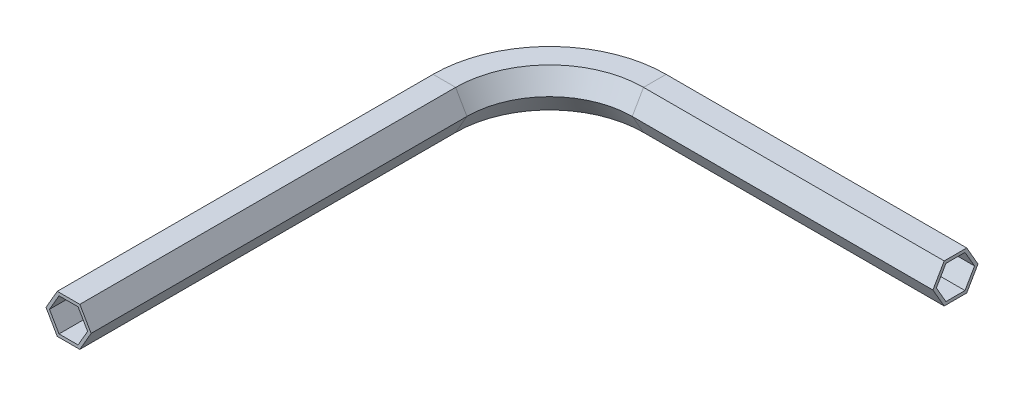
ISO-10303-21;
HEADER;
FILE_DESCRIPTION(('STEP AP214'),'2;1');
FILE_NAME('part.step','',(''),(''),'','','');
FILE_SCHEMA(('AUTOMOTIVE_DESIGN { 1 0 10303 214 1 1 1 1 }'));
ENDSEC;
DATA;
#1=APPLICATION_CONTEXT('core data for automotive mechanical design processes');
#2=APPLICATION_PROTOCOL_DEFINITION('international standard','automotive_design',2000,#1);
#3=PRODUCT_CONTEXT('',#1,'mechanical');
#4=PRODUCT('Part','Part','',(#3));
#5=PRODUCT_RELATED_PRODUCT_CATEGORY('part','',(#4));
#6=PRODUCT_DEFINITION_FORMATION('','',#4);
#7=PRODUCT_DEFINITION_CONTEXT('part definition',#1,'design');
#8=PRODUCT_DEFINITION('design','',#6,#7);
#9=PRODUCT_DEFINITION_SHAPE('','',#8);
#10=(LENGTH_UNIT() NAMED_UNIT(*) SI_UNIT(.MILLI.,.METRE.));
#11=(NAMED_UNIT(*) PLANE_ANGLE_UNIT() SI_UNIT($,.RADIAN.));
#12=(NAMED_UNIT(*) SI_UNIT($,.STERADIAN.) SOLID_ANGLE_UNIT());
#13=UNCERTAINTY_MEASURE_WITH_UNIT(LENGTH_MEASURE(1.E-05),#10,'distance_accuracy_value','');
#14=(GEOMETRIC_REPRESENTATION_CONTEXT(3) GLOBAL_UNCERTAINTY_ASSIGNED_CONTEXT((#13)) GLOBAL_UNIT_ASSIGNED_CONTEXT((#10,
#11,#12)) REPRESENTATION_CONTEXT('',''));
#15=CARTESIAN_POINT('',(0.,0.,0.));
#16=DIRECTION('',(0.,0.,1.));
#17=DIRECTION('',(1.,0.,0.));
#18=AXIS2_PLACEMENT_3D('',#15,#16,#17);
#19=CARTESIAN_POINT('',(0.,0.,0.));
#20=DIRECTION('',(0.,0.,1.));
#21=DIRECTION('',(1.,0.,0.));
#22=AXIS2_PLACEMENT_3D('',#19,#20,#21);
#23=PLANE('',#22);
#24=DIRECTION('',(-0.5,0.866025403784439,0.));
#25=VECTOR('',#24,1.);
#26=CARTESIAN_POINT('',(150.,0.,0.));
#27=LINE('',#26,#25);
#28=CARTESIAN_POINT('',(150.,0.,0.));
#29=VERTEX_POINT('',#28);
#30=CARTESIAN_POINT('',(75.,129.903810567666,0.));
#31=VERTEX_POINT('',#30);
#32=EDGE_CURVE('E367',#29,#31,#27,.T.);
#33=ORIENTED_EDGE('',*,*,#32,.T.);
#34=DIRECTION('',(-1.,0.,0.));
#35=VECTOR('',#34,1.);
#36=CARTESIAN_POINT('',(75.,129.903810567666,0.));
#37=LINE('',#36,#35);
#38=CARTESIAN_POINT('',(-75.,129.903810567666,0.));
#39=VERTEX_POINT('',#38);
#40=EDGE_CURVE('E371',#31,#39,#37,.T.);
#41=ORIENTED_EDGE('',*,*,#40,.T.);
#42=DIRECTION('',(-0.5,-0.866025403784439,0.));
#43=VECTOR('',#42,1.);
#44=CARTESIAN_POINT('',(-75.,129.903810567666,0.));
#45=LINE('',#44,#43);
#46=CARTESIAN_POINT('',(-150.,0.,0.));
#47=VERTEX_POINT('',#46);
#48=EDGE_CURVE('E416',#39,#47,#45,.T.);
#49=ORIENTED_EDGE('',*,*,#48,.T.);
#50=DIRECTION('',(0.5,-0.866025403784438,0.));
#51=VECTOR('',#50,1.);
#52=CARTESIAN_POINT('',(-150.,0.,0.));
#53=LINE('',#52,#51);
#54=CARTESIAN_POINT('',(-75.,-129.903810567666,0.));
#55=VERTEX_POINT('',#54);
#56=EDGE_CURVE('E443',#47,#55,#53,.T.);
#57=ORIENTED_EDGE('',*,*,#56,.T.);
#58=DIRECTION('',(1.,0.,0.));
#59=VECTOR('',#58,1.);
#60=CARTESIAN_POINT('',(-75.,-129.903810567666,0.));
#61=LINE('',#60,#59);
#62=CARTESIAN_POINT('',(75.,-129.903810567666,0.));
#63=VERTEX_POINT('',#62);
#64=EDGE_CURVE('E470',#55,#63,#61,.T.);
#65=ORIENTED_EDGE('',*,*,#64,.T.);
#66=DIRECTION('',(0.5,0.866025403784439,0.));
#67=VECTOR('',#66,1.);
#68=CARTESIAN_POINT('',(75.,-129.903810567666,0.));
#69=LINE('',#68,#67);
#70=EDGE_CURVE('E385',#63,#29,#69,.T.);
#71=ORIENTED_EDGE('',*,*,#70,.T.);
#72=EDGE_LOOP('',(#33,#41,#49,#57,#65,#71));
#73=FACE_BOUND('',#72,.T.);
#74=DIRECTION('',(-0.5,0.866025403784439,0.));
#75=VECTOR('',#74,1.);
#76=CARTESIAN_POINT('',(126.905989232415,0.,0.));
#77=LINE('',#76,#75);
#78=CARTESIAN_POINT('',(126.905989232415,0.,0.));
#79=VERTEX_POINT('',#78);
#80=CARTESIAN_POINT('',(63.4529946162075,109.903810567666,0.));
#81=VERTEX_POINT('',#80);
#82=EDGE_CURVE('E221',#79,#81,#77,.T.);
#83=ORIENTED_EDGE('',*,*,#82,.F.);
#84=DIRECTION('',(0.5,0.866025403784439,0.));
#85=VECTOR('',#84,1.);
#86=CARTESIAN_POINT('',(63.4529946162075,-109.903810567666,0.));
#87=LINE('',#86,#85);
#88=CARTESIAN_POINT('',(63.4529946162075,-109.903810567666,0.));
#89=VERTEX_POINT('',#88);
#90=EDGE_CURVE('E213',#89,#79,#87,.T.);
#91=ORIENTED_EDGE('',*,*,#90,.F.);
#92=DIRECTION('',(1.,0.,0.));
#93=VECTOR('',#92,1.);
#94=CARTESIAN_POINT('',(-63.4529946162074,-109.903810567666,0.));
#95=LINE('',#94,#93);
#96=CARTESIAN_POINT('',(-63.4529946162074,-109.903810567666,0.));
#97=VERTEX_POINT('',#96);
#98=EDGE_CURVE('E199',#97,#89,#95,.T.);
#99=ORIENTED_EDGE('',*,*,#98,.F.);
#100=DIRECTION('',(0.5,-0.866025403784438,0.));
#101=VECTOR('',#100,1.);
#102=CARTESIAN_POINT('',(-126.905989232415,0.,0.));
#103=LINE('',#102,#101);
#104=CARTESIAN_POINT('',(-126.905989232415,0.,0.));
#105=VERTEX_POINT('',#104);
#106=EDGE_CURVE('E207',#105,#97,#103,.T.);
#107=ORIENTED_EDGE('',*,*,#106,.F.);
#108=DIRECTION('',(-0.5,-0.866025403784439,0.));
#109=VECTOR('',#108,1.);
#110=CARTESIAN_POINT('',(-63.4529946162075,109.903810567666,0.));
#111=LINE('',#110,#109);
#112=CARTESIAN_POINT('',(-63.4529946162075,109.903810567666,0.));
#113=VERTEX_POINT('',#112);
#114=EDGE_CURVE('E286',#113,#105,#111,.T.);
#115=ORIENTED_EDGE('',*,*,#114,.F.);
#116=DIRECTION('',(-1.,0.,0.));
#117=VECTOR('',#116,1.);
#118=CARTESIAN_POINT('',(63.4529946162075,109.903810567666,0.));
#119=LINE('',#118,#117);
#120=EDGE_CURVE('E225',#81,#113,#119,.T.);
#121=ORIENTED_EDGE('',*,*,#120,.F.);
#122=EDGE_LOOP('',(#83,#91,#99,#107,#115,#121));
#123=FACE_BOUND('',#122,.T.);
#124=ADVANCED_FACE('F39',(#73,#123),#23,.T.);
#125=CARTESIAN_POINT('',(2700.,0.,-3200.));
#126=DIRECTION('',(-1.,0.,0.));
#127=DIRECTION('',(0.,0.,1.));
#128=AXIS2_PLACEMENT_3D('',#125,#126,#127);
#129=PLANE('',#128);
#130=DIRECTION('',(0.,0.866025403784439,-0.5));
#131=VECTOR('',#130,1.);
#132=CARTESIAN_POINT('',(2700.,0.,-3050.));
#133=LINE('',#132,#131);
#134=CARTESIAN_POINT('',(2700.,0.,-3050.));
#135=VERTEX_POINT('',#134);
#136=CARTESIAN_POINT('',(2700.,129.903810567666,-3125.));
#137=VERTEX_POINT('',#136);
#138=EDGE_CURVE('E400',#135,#137,#133,.T.);
#139=ORIENTED_EDGE('',*,*,#138,.F.);
#140=DIRECTION('',(0.,0.866025403784439,0.5));
#141=VECTOR('',#140,1.);
#142=CARTESIAN_POINT('',(2700.,-129.903810567666,-3125.));
#143=LINE('',#142,#141);
#144=CARTESIAN_POINT('',(2700.,-129.903810567666,-3125.));
#145=VERTEX_POINT('',#144);
#146=EDGE_CURVE('E11',#145,#135,#143,.T.);
#147=ORIENTED_EDGE('',*,*,#146,.F.);
#148=DIRECTION('',(0.,0.,1.));
#149=VECTOR('',#148,1.);
#150=CARTESIAN_POINT('',(2700.,-129.903810567666,-3275.));
#151=LINE('',#150,#149);
#152=CARTESIAN_POINT('',(2700.,-129.903810567666,-3275.));
#153=VERTEX_POINT('',#152);
#154=EDGE_CURVE('E493',#153,#145,#151,.T.);
#155=ORIENTED_EDGE('',*,*,#154,.F.);
#156=DIRECTION('',(0.,-0.866025403784438,0.5));
#157=VECTOR('',#156,1.);
#158=CARTESIAN_POINT('',(2700.,0.,-3350.));
#159=LINE('',#158,#157);
#160=CARTESIAN_POINT('',(2700.,0.,-3350.));
#161=VERTEX_POINT('',#160);
#162=EDGE_CURVE('E466',#161,#153,#159,.T.);
#163=ORIENTED_EDGE('',*,*,#162,.F.);
#164=DIRECTION('',(0.,-0.866025403784439,-0.5));
#165=VECTOR('',#164,1.);
#166=CARTESIAN_POINT('',(2700.,129.903810567666,-3275.));
#167=LINE('',#166,#165);
#168=CARTESIAN_POINT('',(2700.,129.903810567666,-3275.));
#169=VERTEX_POINT('',#168);
#170=EDGE_CURVE('E439',#169,#161,#167,.T.);
#171=ORIENTED_EDGE('',*,*,#170,.F.);
#172=DIRECTION('',(0.,0.,-1.));
#173=VECTOR('',#172,1.);
#174=CARTESIAN_POINT('',(2700.,129.903810567666,-3125.));
#175=LINE('',#174,#173);
#176=EDGE_CURVE('E408',#137,#169,#175,.T.);
#177=ORIENTED_EDGE('',*,*,#176,.F.);
#178=EDGE_LOOP('',(#139,#147,#155,#163,#171,#177));
#179=FACE_BOUND('',#178,.T.);
#180=DIRECTION('',(0.,0.866025403784438,0.5));
#181=VECTOR('',#180,1.);
#182=CARTESIAN_POINT('',(2700.,-109.903810567665,-3136.54700538379));
#183=LINE('',#182,#181);
#184=CARTESIAN_POINT('',(2700.,-109.903810567665,-3136.54700538379));
#185=VERTEX_POINT('',#184);
#186=CARTESIAN_POINT('',(2700.,4.76135235692095E-13,-3073.09401076759));
#187=VERTEX_POINT('',#186);
#188=EDGE_CURVE('E248',#185,#187,#183,.T.);
#189=ORIENTED_EDGE('',*,*,#188,.T.);
#190=DIRECTION('',(0.,0.866025403784439,-0.5));
#191=VECTOR('',#190,1.);
#192=CARTESIAN_POINT('',(2700.,4.76135235692095E-13,-3073.09401076759));
#193=LINE('',#192,#191);
#194=CARTESIAN_POINT('',(2700.,109.903810567666,-3136.54700538379));
#195=VERTEX_POINT('',#194);
#196=EDGE_CURVE('E256',#187,#195,#193,.T.);
#197=ORIENTED_EDGE('',*,*,#196,.T.);
#198=DIRECTION('',(0.,0.,-1.));
#199=VECTOR('',#198,1.);
#200=CARTESIAN_POINT('',(2700.,109.903810567666,-3136.54700538379));
#201=LINE('',#200,#199);
#202=CARTESIAN_POINT('',(2700.,109.903810567666,-3263.45299461621));
#203=VERTEX_POINT('',#202);
#204=EDGE_CURVE('E283',#195,#203,#201,.T.);
#205=ORIENTED_EDGE('',*,*,#204,.T.);
#206=DIRECTION('',(0.,-0.866025403784438,-0.5));
#207=VECTOR('',#206,1.);
#208=CARTESIAN_POINT('',(2700.,109.903810567666,-3263.45299461621));
#209=LINE('',#208,#207);
#210=CARTESIAN_POINT('',(2700.,5.15428102636023E-13,-3326.90598923241));
#211=VERTEX_POINT('',#210);
#212=EDGE_CURVE('E310',#203,#211,#209,.T.);
#213=ORIENTED_EDGE('',*,*,#212,.T.);
#214=DIRECTION('',(0.,-0.866025403784439,0.5));
#215=VECTOR('',#214,1.);
#216=CARTESIAN_POINT('',(2700.,5.15428102636023E-13,-3326.90598923241));
#217=LINE('',#216,#215);
#218=CARTESIAN_POINT('',(2700.,-109.903810567665,-3263.45299461621));
#219=VERTEX_POINT('',#218);
#220=EDGE_CURVE('E336',#211,#219,#217,.T.);
#221=ORIENTED_EDGE('',*,*,#220,.T.);
#222=DIRECTION('',(0.,0.,1.));
#223=VECTOR('',#222,1.);
#224=CARTESIAN_POINT('',(2700.,-109.903810567665,-3263.45299461621));
#225=LINE('',#224,#223);
#226=EDGE_CURVE('E357',#219,#185,#225,.T.);
#227=ORIENTED_EDGE('',*,*,#226,.T.);
#228=EDGE_LOOP('',(#189,#197,#205,#213,#221,#227));
#229=FACE_BOUND('',#228,.T.);
#230=ADVANCED_FACE('F558',(#179,#229),#129,.F.);
#231=CARTESIAN_POINT('',(150.,0.,0.));
#232=DIRECTION('',(-0.866025403784438,-0.5,0.));
#233=DIRECTION('',(0.5,-0.866025403784439,0.));
#234=AXIS2_PLACEMENT_3D('',#231,#232,#233);
#235=PLANE('',#234);
#236=DIRECTION('',(0.,0.,-1.));
#237=VECTOR('',#236,1.);
#238=CARTESIAN_POINT('',(75.,129.903810567666,0.));
#239=LINE('',#238,#237);
#240=CARTESIAN_POINT('',(75.,129.903810567666,-2500.));
#241=VERTEX_POINT('',#240);
#242=EDGE_CURVE('E376',#31,#241,#239,.T.);
#243=ORIENTED_EDGE('',*,*,#242,.F.);
#244=ORIENTED_EDGE('',*,*,#32,.F.);
#245=DIRECTION('',(0.,0.,-1.));
#246=VECTOR('',#245,1.);
#247=CARTESIAN_POINT('',(150.,0.,0.));
#248=LINE('',#247,#246);
#249=CARTESIAN_POINT('',(150.,0.,-2500.));
#250=VERTEX_POINT('',#249);
#251=EDGE_CURVE('E377',#29,#250,#248,.T.);
#252=ORIENTED_EDGE('',*,*,#251,.T.);
#253=DIRECTION('',(-0.5,0.866025403784439,0.));
#254=VECTOR('',#253,1.);
#255=CARTESIAN_POINT('',(150.,0.,-2500.));
#256=LINE('',#255,#254);
#257=EDGE_CURVE('E372',#250,#241,#256,.T.);
#258=ORIENTED_EDGE('',*,*,#257,.T.);
#259=EDGE_LOOP('',(#243,#244,#252,#258));
#260=FACE_BOUND('',#259,.T.);
#261=ADVANCED_FACE('F539',(#260),#235,.F.);
#262=CARTESIAN_POINT('',(75.,129.903810567666,0.));
#263=DIRECTION('',(0.,-1.,0.));
#264=DIRECTION('',(1.,0.,0.));
#265=AXIS2_PLACEMENT_3D('',#262,#263,#264);
#266=PLANE('',#265);
#267=DIRECTION('',(0.,0.,-1.));
#268=VECTOR('',#267,1.);
#269=CARTESIAN_POINT('',(-75.,129.903810567666,0.));
#270=LINE('',#269,#268);
#271=CARTESIAN_POINT('',(-75.,129.903810567666,-2500.));
#272=VERTEX_POINT('',#271);
#273=EDGE_CURVE('E420',#39,#272,#270,.T.);
#274=ORIENTED_EDGE('',*,*,#273,.F.);
#275=ORIENTED_EDGE('',*,*,#40,.F.);
#276=ORIENTED_EDGE('',*,*,#242,.T.);
#277=DIRECTION('',(-1.,0.,0.));
#278=VECTOR('',#277,1.);
#279=CARTESIAN_POINT('',(75.,129.903810567666,-2500.));
#280=LINE('',#279,#278);
#281=EDGE_CURVE('E381',#241,#272,#280,.T.);
#282=ORIENTED_EDGE('',*,*,#281,.T.);
#283=EDGE_LOOP('',(#274,#275,#276,#282));
#284=FACE_BOUND('',#283,.T.);
#285=ADVANCED_FACE('F570',(#284),#266,.F.);
#286=CARTESIAN_POINT('',(-75.,129.903810567666,0.));
#287=DIRECTION('',(0.866025403784438,-0.5,0.));
#288=DIRECTION('',(0.5,0.866025403784439,0.));
#289=AXIS2_PLACEMENT_3D('',#286,#287,#288);
#290=PLANE('',#289);
#291=DIRECTION('',(0.,0.,-1.));
#292=VECTOR('',#291,1.);
#293=CARTESIAN_POINT('',(-150.,0.,0.));
#294=LINE('',#293,#292);
#295=CARTESIAN_POINT('',(-150.,0.,-2500.));
#296=VERTEX_POINT('',#295);
#297=EDGE_CURVE('E447',#47,#296,#294,.T.);
#298=ORIENTED_EDGE('',*,*,#297,.F.);
#299=ORIENTED_EDGE('',*,*,#48,.F.);
#300=ORIENTED_EDGE('',*,*,#273,.T.);
#301=DIRECTION('',(-0.5,-0.866025403784439,0.));
#302=VECTOR('',#301,1.);
#303=CARTESIAN_POINT('',(-75.,129.903810567666,-2500.));
#304=LINE('',#303,#302);
#305=EDGE_CURVE('E424',#272,#296,#304,.T.);
#306=ORIENTED_EDGE('',*,*,#305,.T.);
#307=EDGE_LOOP('',(#298,#299,#300,#306));
#308=FACE_BOUND('',#307,.T.);
#309=ADVANCED_FACE('F586',(#308),#290,.F.);
#310=CARTESIAN_POINT('',(-150.,0.,0.));
#311=DIRECTION('',(0.866025403784439,0.5,0.));
#312=DIRECTION('',(-0.5,0.866025403784439,0.));
#313=AXIS2_PLACEMENT_3D('',#310,#311,#312);
#314=PLANE('',#313);
#315=DIRECTION('',(0.,0.,-1.));
#316=VECTOR('',#315,1.);
#317=CARTESIAN_POINT('',(-75.,-129.903810567666,0.));
#318=LINE('',#317,#316);
#319=CARTESIAN_POINT('',(-75.,-129.903810567666,-2500.));
#320=VERTEX_POINT('',#319);
#321=EDGE_CURVE('E474',#55,#320,#318,.T.);
#322=ORIENTED_EDGE('',*,*,#321,.F.);
#323=ORIENTED_EDGE('',*,*,#56,.F.);
#324=ORIENTED_EDGE('',*,*,#297,.T.);
#325=DIRECTION('',(0.5,-0.866025403784438,0.));
#326=VECTOR('',#325,1.);
#327=CARTESIAN_POINT('',(-150.,0.,-2500.));
#328=LINE('',#327,#326);
#329=EDGE_CURVE('E451',#296,#320,#328,.T.);
#330=ORIENTED_EDGE('',*,*,#329,.T.);
#331=EDGE_LOOP('',(#322,#323,#324,#330));
#332=FACE_BOUND('',#331,.T.);
#333=ADVANCED_FACE('F574',(#332),#314,.F.);
#334=CARTESIAN_POINT('',(-75.,-129.903810567666,0.));
#335=DIRECTION('',(0.,1.,0.));
#336=DIRECTION('',(-1.,0.,0.));
#337=AXIS2_PLACEMENT_3D('',#334,#335,#336);
#338=PLANE('',#337);
#339=DIRECTION('',(0.,0.,-1.));
#340=VECTOR('',#339,1.);
#341=CARTESIAN_POINT('',(75.,-129.903810567666,0.));
#342=LINE('',#341,#340);
#343=CARTESIAN_POINT('',(75.,-129.903810567666,-2500.));
#344=VERTEX_POINT('',#343);
#345=EDGE_CURVE('E500',#63,#344,#342,.T.);
#346=ORIENTED_EDGE('',*,*,#345,.F.);
#347=ORIENTED_EDGE('',*,*,#64,.F.);
#348=ORIENTED_EDGE('',*,*,#321,.T.);
#349=DIRECTION('',(1.,0.,0.));
#350=VECTOR('',#349,1.);
#351=CARTESIAN_POINT('',(-75.,-129.903810567666,-2500.));
#352=LINE('',#351,#350);
#353=EDGE_CURVE('E478',#320,#344,#352,.T.);
#354=ORIENTED_EDGE('',*,*,#353,.T.);
#355=EDGE_LOOP('',(#346,#347,#348,#354));
#356=FACE_BOUND('',#355,.T.);
#357=ADVANCED_FACE('F545',(#356),#338,.F.);
#358=CARTESIAN_POINT('',(75.,-129.903810567666,0.));
#359=DIRECTION('',(-0.866025403784438,0.5,0.));
#360=DIRECTION('',(-0.5,-0.866025403784439,0.));
#361=AXIS2_PLACEMENT_3D('',#358,#359,#360);
#362=PLANE('',#361);
#363=DIRECTION('',(0.5,0.866025403784439,0.));
#364=VECTOR('',#363,1.);
#365=CARTESIAN_POINT('',(75.,-129.903810567666,-2500.));
#366=LINE('',#365,#364);
#367=EDGE_CURVE('E399',#344,#250,#366,.T.);
#368=ORIENTED_EDGE('',*,*,#367,.T.);
#369=ORIENTED_EDGE('',*,*,#251,.F.);
#370=ORIENTED_EDGE('',*,*,#70,.F.);
#371=ORIENTED_EDGE('',*,*,#345,.T.);
#372=EDGE_LOOP('',(#368,#369,#370,#371));
#373=FACE_BOUND('',#372,.T.);
#374=ADVANCED_FACE('F541',(#373),#362,.F.);
#375=CARTESIAN_POINT('',(700.,0.,-2500.));
#376=DIRECTION('',(0.,1.,0.));
#377=DIRECTION('',(0.,0.,1.));
#378=AXIS2_PLACEMENT_3D('',#375,#376,#377);
#379=CONICAL_SURFACE('',#378,550.,0.523598775598299);
#380=CARTESIAN_POINT('',(700.,129.903810567666,-2500.));
#381=DIRECTION('',(0.,-1.,0.));
#382=DIRECTION('',(-1.,0.,0.));
#383=AXIS2_PLACEMENT_3D('',#380,#381,#382);
#384=CIRCLE('',#383,625.);
#385=CARTESIAN_POINT('',(700.,129.903810567666,-3125.));
#386=VERTEX_POINT('',#385);
#387=EDGE_CURVE('E390',#241,#386,#384,.T.);
#388=ORIENTED_EDGE('',*,*,#387,.F.);
#389=ORIENTED_EDGE('',*,*,#257,.F.);
#390=CARTESIAN_POINT('',(700.,0.,-2500.));
#391=DIRECTION('',(0.,-1.,0.));
#392=DIRECTION('',(-1.,0.,0.));
#393=AXIS2_PLACEMENT_3D('',#390,#391,#392);
#394=CIRCLE('',#393,550.);
#395=CARTESIAN_POINT('',(700.,0.,-3050.));
#396=VERTEX_POINT('',#395);
#397=EDGE_CURVE('E391',#250,#396,#394,.T.);
#398=ORIENTED_EDGE('',*,*,#397,.T.);
#399=DIRECTION('',(0.,0.866025403784439,-0.5));
#400=VECTOR('',#399,1.);
#401=CARTESIAN_POINT('',(700.,0.,-3050.));
#402=LINE('',#401,#400);
#403=EDGE_CURVE('E386',#396,#386,#402,.T.);
#404=ORIENTED_EDGE('',*,*,#403,.T.);
#405=EDGE_LOOP('',(#388,#389,#398,#404));
#406=FACE_BOUND('',#405,.T.);
#407=ADVANCED_FACE('F534',(#406),#379,.F.);
#408=CARTESIAN_POINT('',(74.9999999999999,129.903810567666,-2500.));
#409=DIRECTION('',(0.,-1.,0.));
#410=DIRECTION('',(0.,0.,-1.));
#411=AXIS2_PLACEMENT_3D('',#408,#409,#410);
#412=PLANE('',#411);
#413=CARTESIAN_POINT('',(700.,129.903810567666,-2500.));
#414=DIRECTION('',(0.,-1.,0.));
#415=DIRECTION('',(-1.,0.,0.));
#416=AXIS2_PLACEMENT_3D('',#413,#414,#415);
#417=CIRCLE('',#416,775.);
#418=CARTESIAN_POINT('',(700.,129.903810567666,-3275.));
#419=VERTEX_POINT('',#418);
#420=EDGE_CURVE('E428',#272,#419,#417,.T.);
#421=ORIENTED_EDGE('',*,*,#420,.F.);
#422=ORIENTED_EDGE('',*,*,#281,.F.);
#423=ORIENTED_EDGE('',*,*,#387,.T.);
#424=DIRECTION('',(0.,0.,-1.));
#425=VECTOR('',#424,1.);
#426=CARTESIAN_POINT('',(700.,129.903810567666,-3125.));
#427=LINE('',#426,#425);
#428=EDGE_CURVE('E395',#386,#419,#427,.T.);
#429=ORIENTED_EDGE('',*,*,#428,.T.);
#430=EDGE_LOOP('',(#421,#422,#423,#429));
#431=FACE_BOUND('',#430,.T.);
#432=ADVANCED_FACE('F566',(#431),#412,.F.);
#433=CARTESIAN_POINT('',(700.,129.903810567666,-2500.));
#434=DIRECTION('',(0.,-1.,0.));
#435=DIRECTION('',(0.,0.,-1.));
#436=AXIS2_PLACEMENT_3D('',#433,#434,#435);
#437=CONICAL_SURFACE('',#436,775.,0.523598775598299);
#438=CARTESIAN_POINT('',(700.,0.,-2500.));
#439=DIRECTION('',(0.,-1.,0.));
#440=DIRECTION('',(-1.,0.,0.));
#441=AXIS2_PLACEMENT_3D('',#438,#439,#440);
#442=CIRCLE('',#441,850.);
#443=CARTESIAN_POINT('',(700.,0.,-3350.));
#444=VERTEX_POINT('',#443);
#445=EDGE_CURVE('E455',#296,#444,#442,.T.);
#446=ORIENTED_EDGE('',*,*,#445,.F.);
#447=ORIENTED_EDGE('',*,*,#305,.F.);
#448=ORIENTED_EDGE('',*,*,#420,.T.);
#449=DIRECTION('',(0.,-0.866025403784439,-0.5));
#450=VECTOR('',#449,1.);
#451=CARTESIAN_POINT('',(700.,129.903810567666,-3275.));
#452=LINE('',#451,#450);
#453=EDGE_CURVE('E432',#419,#444,#452,.T.);
#454=ORIENTED_EDGE('',*,*,#453,.T.);
#455=EDGE_LOOP('',(#446,#447,#448,#454));
#456=FACE_BOUND('',#455,.T.);
#457=ADVANCED_FACE('F584',(#456),#437,.T.);
#458=CARTESIAN_POINT('',(700.,0.,-2500.));
#459=DIRECTION('',(0.,1.,0.));
#460=DIRECTION('',(0.,0.,1.));
#461=AXIS2_PLACEMENT_3D('',#458,#459,#460);
#462=CONICAL_SURFACE('',#461,850.,0.523598775598299);
#463=CARTESIAN_POINT('',(700.,-129.903810567666,-2500.));
#464=DIRECTION('',(0.,-1.,0.));
#465=DIRECTION('',(-1.,0.,0.));
#466=AXIS2_PLACEMENT_3D('',#463,#464,#465);
#467=CIRCLE('',#466,775.);
#468=CARTESIAN_POINT('',(700.,-129.903810567666,-3275.));
#469=VERTEX_POINT('',#468);
#470=EDGE_CURVE('E482',#320,#469,#467,.T.);
#471=ORIENTED_EDGE('',*,*,#470,.F.);
#472=ORIENTED_EDGE('',*,*,#329,.F.);
#473=ORIENTED_EDGE('',*,*,#445,.T.);
#474=DIRECTION('',(0.,-0.866025403784438,0.5));
#475=VECTOR('',#474,1.);
#476=CARTESIAN_POINT('',(700.,0.,-3350.));
#477=LINE('',#476,#475);
#478=EDGE_CURVE('E459',#444,#469,#477,.T.);
#479=ORIENTED_EDGE('',*,*,#478,.T.);
#480=EDGE_LOOP('',(#471,#472,#473,#479));
#481=FACE_BOUND('',#480,.T.);
#482=ADVANCED_FACE('F577',(#481),#462,.T.);
#483=CARTESIAN_POINT('',(-75.0000000000001,-129.903810567666,-2500.));
#484=DIRECTION('',(0.,1.,0.));
#485=DIRECTION('',(0.,0.,1.));
#486=AXIS2_PLACEMENT_3D('',#483,#484,#485);
#487=PLANE('',#486);
#488=CARTESIAN_POINT('',(700.,-129.903810567666,-2500.));
#489=DIRECTION('',(0.,-1.,0.));
#490=DIRECTION('',(-1.,0.,0.));
#491=AXIS2_PLACEMENT_3D('',#488,#489,#490);
#492=CIRCLE('',#491,625.);
#493=CARTESIAN_POINT('',(700.,-129.903810567666,-3125.));
#494=VERTEX_POINT('',#493);
#495=EDGE_CURVE('E507',#344,#494,#492,.T.);
#496=ORIENTED_EDGE('',*,*,#495,.F.);
#497=ORIENTED_EDGE('',*,*,#353,.F.);
#498=ORIENTED_EDGE('',*,*,#470,.T.);
#499=DIRECTION('',(0.,0.,1.));
#500=VECTOR('',#499,1.);
#501=CARTESIAN_POINT('',(700.,-129.903810567666,-3275.));
#502=LINE('',#501,#500);
#503=EDGE_CURVE('E486',#469,#494,#502,.T.);
#504=ORIENTED_EDGE('',*,*,#503,.T.);
#505=EDGE_LOOP('',(#496,#497,#498,#504));
#506=FACE_BOUND('',#505,.T.);
#507=ADVANCED_FACE('F548',(#506),#487,.F.);
#508=CARTESIAN_POINT('',(700.,-129.903810567666,-2500.));
#509=DIRECTION('',(0.,-1.,0.));
#510=DIRECTION('',(0.,0.,-1.));
#511=AXIS2_PLACEMENT_3D('',#508,#509,#510);
#512=CONICAL_SURFACE('',#511,625.,0.523598775598299);
#513=DIRECTION('',(0.,0.866025403784439,0.5));
#514=VECTOR('',#513,1.);
#515=CARTESIAN_POINT('',(700.,-129.903810567666,-3125.));
#516=LINE('',#515,#514);
#517=EDGE_CURVE('E412',#494,#396,#516,.T.);
#518=ORIENTED_EDGE('',*,*,#517,.T.);
#519=ORIENTED_EDGE('',*,*,#397,.F.);
#520=ORIENTED_EDGE('',*,*,#367,.F.);
#521=ORIENTED_EDGE('',*,*,#495,.T.);
#522=EDGE_LOOP('',(#518,#519,#520,#521));
#523=FACE_BOUND('',#522,.T.);
#524=ADVANCED_FACE('F526',(#523),#512,.F.);
#525=CARTESIAN_POINT('',(700.,0.,-3050.));
#526=DIRECTION('',(0.,-0.5,-0.866025403784439));
#527=DIRECTION('',(0.,0.866025403784439,-0.5));
#528=AXIS2_PLACEMENT_3D('',#525,#526,#527);
#529=PLANE('',#528);
#530=DIRECTION('',(1.,0.,0.));
#531=VECTOR('',#530,1.);
#532=CARTESIAN_POINT('',(700.,129.903810567666,-3125.));
#533=LINE('',#532,#531);
#534=EDGE_CURVE('E403',#386,#137,#533,.T.);
#535=ORIENTED_EDGE('',*,*,#534,.F.);
#536=ORIENTED_EDGE('',*,*,#403,.F.);
#537=DIRECTION('',(1.,0.,0.));
#538=VECTOR('',#537,1.);
#539=CARTESIAN_POINT('',(700.,0.,-3050.));
#540=LINE('',#539,#538);
#541=EDGE_CURVE('E404',#396,#135,#540,.T.);
#542=ORIENTED_EDGE('',*,*,#541,.T.);
#543=ORIENTED_EDGE('',*,*,#138,.T.);
#544=EDGE_LOOP('',(#535,#536,#542,#543));
#545=FACE_BOUND('',#544,.T.);
#546=ADVANCED_FACE('F530',(#545),#529,.F.);
#547=CARTESIAN_POINT('',(700.,129.903810567666,-3125.));
#548=DIRECTION('',(0.,-1.,0.));
#549=DIRECTION('',(0.,0.,-1.));
#550=AXIS2_PLACEMENT_3D('',#547,#548,#549);
#551=PLANE('',#550);
#552=DIRECTION('',(1.,0.,0.));
#553=VECTOR('',#552,1.);
#554=CARTESIAN_POINT('',(700.,129.903810567666,-3275.));
#555=LINE('',#554,#553);
#556=EDGE_CURVE('E435',#419,#169,#555,.T.);
#557=ORIENTED_EDGE('',*,*,#556,.F.);
#558=ORIENTED_EDGE('',*,*,#428,.F.);
#559=ORIENTED_EDGE('',*,*,#534,.T.);
#560=ORIENTED_EDGE('',*,*,#176,.T.);
#561=EDGE_LOOP('',(#557,#558,#559,#560));
#562=FACE_BOUND('',#561,.T.);
#563=ADVANCED_FACE('F563',(#562),#551,.F.);
#564=CARTESIAN_POINT('',(700.,129.903810567666,-3275.));
#565=DIRECTION('',(0.,-0.5,0.866025403784438));
#566=DIRECTION('',(0.,-0.866025403784439,-0.5));
#567=AXIS2_PLACEMENT_3D('',#564,#565,#566);
#568=PLANE('',#567);
#569=DIRECTION('',(1.,0.,0.));
#570=VECTOR('',#569,1.);
#571=CARTESIAN_POINT('',(700.,0.,-3350.));
#572=LINE('',#571,#570);
#573=EDGE_CURVE('E462',#444,#161,#572,.T.);
#574=ORIENTED_EDGE('',*,*,#573,.F.);
#575=ORIENTED_EDGE('',*,*,#453,.F.);
#576=ORIENTED_EDGE('',*,*,#556,.T.);
#577=ORIENTED_EDGE('',*,*,#170,.T.);
#578=EDGE_LOOP('',(#574,#575,#576,#577));
#579=FACE_BOUND('',#578,.T.);
#580=ADVANCED_FACE('F582',(#579),#568,.F.);
#581=CARTESIAN_POINT('',(700.,0.,-3350.));
#582=DIRECTION('',(0.,0.5,0.866025403784439));
#583=DIRECTION('',(0.,-0.866025403784438,0.5));
#584=AXIS2_PLACEMENT_3D('',#581,#582,#583);
#585=PLANE('',#584);
#586=DIRECTION('',(1.,0.,0.));
#587=VECTOR('',#586,1.);
#588=CARTESIAN_POINT('',(700.,-129.903810567666,-3275.));
#589=LINE('',#588,#587);
#590=EDGE_CURVE('E489',#469,#153,#589,.T.);
#591=ORIENTED_EDGE('',*,*,#590,.F.);
#592=ORIENTED_EDGE('',*,*,#478,.F.);
#593=ORIENTED_EDGE('',*,*,#573,.T.);
#594=ORIENTED_EDGE('',*,*,#162,.T.);
#595=EDGE_LOOP('',(#591,#592,#593,#594));
#596=FACE_BOUND('',#595,.T.);
#597=ADVANCED_FACE('F580',(#596),#585,.F.);
#598=CARTESIAN_POINT('',(700.,-129.903810567666,-3275.));
#599=DIRECTION('',(0.,1.,0.));
#600=DIRECTION('',(0.,0.,1.));
#601=AXIS2_PLACEMENT_3D('',#598,#599,#600);
#602=PLANE('',#601);
#603=DIRECTION('',(1.,0.,0.));
#604=VECTOR('',#603,1.);
#605=CARTESIAN_POINT('',(700.,-129.903810567666,-3125.));
#606=LINE('',#605,#604);
#607=EDGE_CURVE('E47',#494,#145,#606,.T.);
#608=ORIENTED_EDGE('',*,*,#607,.F.);
#609=ORIENTED_EDGE('',*,*,#503,.F.);
#610=ORIENTED_EDGE('',*,*,#590,.T.);
#611=ORIENTED_EDGE('',*,*,#154,.T.);
#612=EDGE_LOOP('',(#608,#609,#610,#611));
#613=FACE_BOUND('',#612,.T.);
#614=ADVANCED_FACE('F551',(#613),#602,.F.);
#615=CARTESIAN_POINT('',(700.,-129.903810567666,-3125.));
#616=DIRECTION('',(0.,0.5,-0.866025403784439));
#617=DIRECTION('',(0.,0.866025403784439,0.5));
#618=AXIS2_PLACEMENT_3D('',#615,#616,#617);
#619=PLANE('',#618);
#620=ORIENTED_EDGE('',*,*,#146,.T.);
#621=ORIENTED_EDGE('',*,*,#541,.F.);
#622=ORIENTED_EDGE('',*,*,#517,.F.);
#623=ORIENTED_EDGE('',*,*,#607,.T.);
#624=EDGE_LOOP('',(#620,#621,#622,#623));
#625=FACE_BOUND('',#624,.T.);
#626=ADVANCED_FACE('F554',(#625),#619,.F.);
#627=CARTESIAN_POINT('',(63.4529946162075,-109.903810567666,0.));
#628=DIRECTION('',(-0.866025403784439,0.5,0.));
#629=DIRECTION('',(-0.5,-0.866025403784439,0.));
#630=AXIS2_PLACEMENT_3D('',#627,#628,#629);
#631=PLANE('',#630);
#632=DIRECTION('',(0.,0.,-1.));
#633=VECTOR('',#632,1.);
#634=CARTESIAN_POINT('',(126.905989232415,0.,0.));
#635=LINE('',#634,#633);
#636=CARTESIAN_POINT('',(126.905989232415,0.,-2500.));
#637=VERTEX_POINT('',#636);
#638=EDGE_CURVE('E230',#79,#637,#635,.T.);
#639=ORIENTED_EDGE('',*,*,#638,.T.);
#640=DIRECTION('',(0.5,0.866025403784439,0.));
#641=VECTOR('',#640,1.);
#642=CARTESIAN_POINT('',(63.4529946162075,-109.903810567666,-2500.));
#643=LINE('',#642,#641);
#644=CARTESIAN_POINT('',(63.4529946162075,-109.903810567666,-2500.));
#645=VERTEX_POINT('',#644);
#646=EDGE_CURVE('E216',#645,#637,#643,.T.);
#647=ORIENTED_EDGE('',*,*,#646,.F.);
#648=DIRECTION('',(0.,0.,-1.));
#649=VECTOR('',#648,1.);
#650=CARTESIAN_POINT('',(63.4529946162075,-109.903810567666,0.));
#651=LINE('',#650,#649);
#652=EDGE_CURVE('E202',#89,#645,#651,.T.);
#653=ORIENTED_EDGE('',*,*,#652,.F.);
#654=ORIENTED_EDGE('',*,*,#90,.T.);
#655=EDGE_LOOP('',(#639,#647,#653,#654));
#656=FACE_BOUND('',#655,.T.);
#657=ADVANCED_FACE('F212',(#656),#631,.T.);
#658=CARTESIAN_POINT('',(126.905989232415,0.,0.));
#659=DIRECTION('',(-0.866025403784439,-0.5,0.));
#660=DIRECTION('',(0.5,-0.866025403784439,0.));
#661=AXIS2_PLACEMENT_3D('',#658,#659,#660);
#662=PLANE('',#661);
#663=DIRECTION('',(0.,0.,-1.));
#664=VECTOR('',#663,1.);
#665=CARTESIAN_POINT('',(63.4529946162075,109.903810567666,0.));
#666=LINE('',#665,#664);
#667=CARTESIAN_POINT('',(63.4529946162075,109.903810567666,-2500.));
#668=VERTEX_POINT('',#667);
#669=EDGE_CURVE('E263',#81,#668,#666,.T.);
#670=ORIENTED_EDGE('',*,*,#669,.T.);
#671=DIRECTION('',(-0.5,0.866025403784439,0.));
#672=VECTOR('',#671,1.);
#673=CARTESIAN_POINT('',(126.905989232415,0.,-2500.));
#674=LINE('',#673,#672);
#675=EDGE_CURVE('E232',#637,#668,#674,.T.);
#676=ORIENTED_EDGE('',*,*,#675,.F.);
#677=ORIENTED_EDGE('',*,*,#638,.F.);
#678=ORIENTED_EDGE('',*,*,#82,.T.);
#679=EDGE_LOOP('',(#670,#676,#677,#678));
#680=FACE_BOUND('',#679,.T.);
#681=ADVANCED_FACE('F612',(#680),#662,.T.);
#682=CARTESIAN_POINT('',(63.4529946162075,109.903810567666,0.));
#683=DIRECTION('',(0.,-1.,0.));
#684=DIRECTION('',(1.,0.,0.));
#685=AXIS2_PLACEMENT_3D('',#682,#683,#684);
#686=PLANE('',#685);
#687=DIRECTION('',(0.,0.,-1.));
#688=VECTOR('',#687,1.);
#689=CARTESIAN_POINT('',(-63.4529946162075,109.903810567666,0.));
#690=LINE('',#689,#688);
#691=CARTESIAN_POINT('',(-63.4529946162075,109.903810567666,-2500.));
#692=VERTEX_POINT('',#691);
#693=EDGE_CURVE('E290',#113,#692,#690,.T.);
#694=ORIENTED_EDGE('',*,*,#693,.T.);
#695=DIRECTION('',(-1.,0.,0.));
#696=VECTOR('',#695,1.);
#697=CARTESIAN_POINT('',(63.4529946162075,109.903810567666,-2500.));
#698=LINE('',#697,#696);
#699=EDGE_CURVE('E267',#668,#692,#698,.T.);
#700=ORIENTED_EDGE('',*,*,#699,.F.);
#701=ORIENTED_EDGE('',*,*,#669,.F.);
#702=ORIENTED_EDGE('',*,*,#120,.T.);
#703=EDGE_LOOP('',(#694,#700,#701,#702));
#704=FACE_BOUND('',#703,.T.);
#705=ADVANCED_FACE('F681',(#704),#686,.T.);
#706=CARTESIAN_POINT('',(-63.4529946162075,109.903810567666,0.));
#707=DIRECTION('',(0.866025403784438,-0.5,0.));
#708=DIRECTION('',(0.5,0.866025403784439,0.));
#709=AXIS2_PLACEMENT_3D('',#706,#707,#708);
#710=PLANE('',#709);
#711=DIRECTION('',(0.,0.,-1.));
#712=VECTOR('',#711,1.);
#713=CARTESIAN_POINT('',(-126.905989232415,0.,0.));
#714=LINE('',#713,#712);
#715=CARTESIAN_POINT('',(-126.905989232415,0.,-2500.));
#716=VERTEX_POINT('',#715);
#717=EDGE_CURVE('E316',#105,#716,#714,.T.);
#718=ORIENTED_EDGE('',*,*,#717,.T.);
#719=DIRECTION('',(-0.5,-0.866025403784439,0.));
#720=VECTOR('',#719,1.);
#721=CARTESIAN_POINT('',(-63.4529946162075,109.903810567666,-2500.));
#722=LINE('',#721,#720);
#723=EDGE_CURVE('E294',#692,#716,#722,.T.);
#724=ORIENTED_EDGE('',*,*,#723,.F.);
#725=ORIENTED_EDGE('',*,*,#693,.F.);
#726=ORIENTED_EDGE('',*,*,#114,.T.);
#727=EDGE_LOOP('',(#718,#724,#725,#726));
#728=FACE_BOUND('',#727,.T.);
#729=ADVANCED_FACE('F669',(#728),#710,.T.);
#730=CARTESIAN_POINT('',(-126.905989232415,0.,0.));
#731=DIRECTION('',(0.866025403784438,0.5,0.));
#732=DIRECTION('',(-0.5,0.866025403784439,0.));
#733=AXIS2_PLACEMENT_3D('',#730,#731,#732);
#734=PLANE('',#733);
#735=DIRECTION('',(0.,0.,-1.));
#736=VECTOR('',#735,1.);
#737=CARTESIAN_POINT('',(-63.4529946162074,-109.903810567666,0.));
#738=LINE('',#737,#736);
#739=CARTESIAN_POINT('',(-63.4529946162074,-109.903810567666,-2500.));
#740=VERTEX_POINT('',#739);
#741=EDGE_CURVE('E54',#97,#740,#738,.T.);
#742=ORIENTED_EDGE('',*,*,#741,.T.);
#743=DIRECTION('',(0.5,-0.866025403784438,0.));
#744=VECTOR('',#743,1.);
#745=CARTESIAN_POINT('',(-126.905989232415,0.,-2500.));
#746=LINE('',#745,#744);
#747=EDGE_CURVE('E320',#716,#740,#746,.T.);
#748=ORIENTED_EDGE('',*,*,#747,.F.);
#749=ORIENTED_EDGE('',*,*,#717,.F.);
#750=ORIENTED_EDGE('',*,*,#106,.T.);
#751=EDGE_LOOP('',(#742,#748,#749,#750));
#752=FACE_BOUND('',#751,.T.);
#753=ADVANCED_FACE('F658',(#752),#734,.T.);
#754=CARTESIAN_POINT('',(-63.4529946162074,-109.903810567666,0.));
#755=DIRECTION('',(0.,1.,0.));
#756=DIRECTION('',(-1.,0.,0.));
#757=AXIS2_PLACEMENT_3D('',#754,#755,#756);
#758=PLANE('',#757);
#759=DIRECTION('',(1.,0.,0.));
#760=VECTOR('',#759,1.);
#761=CARTESIAN_POINT('',(-63.4529946162074,-109.903810567666,-2500.));
#762=LINE('',#761,#760);
#763=EDGE_CURVE('E247',#740,#645,#762,.T.);
#764=ORIENTED_EDGE('',*,*,#763,.F.);
#765=ORIENTED_EDGE('',*,*,#741,.F.);
#766=ORIENTED_EDGE('',*,*,#98,.T.);
#767=ORIENTED_EDGE('',*,*,#652,.T.);
#768=EDGE_LOOP('',(#764,#765,#766,#767));
#769=FACE_BOUND('',#768,.T.);
#770=ADVANCED_FACE('F201',(#769),#758,.T.);
#771=CARTESIAN_POINT('',(700.,-109.903810567666,-2500.));
#772=DIRECTION('',(0.,-1.,0.));
#773=DIRECTION('',(1.,0.,0.));
#774=AXIS2_PLACEMENT_3D('',#771,#772,#773);
#775=CONICAL_SURFACE('',#774,636.547005383792,0.523598775598299);
#776=CARTESIAN_POINT('',(700.,1.11022302462516E-13,-2500.));
#777=DIRECTION('',(0.,-1.,0.));
#778=DIRECTION('',(-1.,0.,0.));
#779=AXIS2_PLACEMENT_3D('',#776,#777,#778);
#780=CIRCLE('',#779,573.094010767585);
#781=CARTESIAN_POINT('',(700.,1.11022302462516E-13,-3073.09401076758));
#782=VERTEX_POINT('',#781);
#783=EDGE_CURVE('E238',#637,#782,#780,.T.);
#784=ORIENTED_EDGE('',*,*,#783,.T.);
#785=DIRECTION('',(0.,0.866025403784438,0.5));
#786=VECTOR('',#785,1.);
#787=CARTESIAN_POINT('',(700.,-109.903810567666,-3136.54700538379));
#788=LINE('',#787,#786);
#789=CARTESIAN_POINT('',(700.,-109.903810567666,-3136.54700538379));
#790=VERTEX_POINT('',#789);
#791=EDGE_CURVE('E234',#790,#782,#788,.T.);
#792=ORIENTED_EDGE('',*,*,#791,.F.);
#793=CARTESIAN_POINT('',(700.,-109.903810567666,-2500.));
#794=DIRECTION('',(0.,-1.,0.));
#795=DIRECTION('',(-1.,0.,0.));
#796=AXIS2_PLACEMENT_3D('',#793,#794,#795);
#797=CIRCLE('',#796,636.547005383792);
#798=EDGE_CURVE('E239',#645,#790,#797,.T.);
#799=ORIENTED_EDGE('',*,*,#798,.F.);
#800=ORIENTED_EDGE('',*,*,#646,.T.);
#801=EDGE_LOOP('',(#784,#792,#799,#800));
#802=FACE_BOUND('',#801,.T.);
#803=ADVANCED_FACE('F657',(#802),#775,.T.);
#804=CARTESIAN_POINT('',(700.,1.11022302462516E-13,-2500.));
#805=DIRECTION('',(0.,1.,0.));
#806=DIRECTION('',(-1.,0.,0.));
#807=AXIS2_PLACEMENT_3D('',#804,#805,#806);
#808=CONICAL_SURFACE('',#807,573.094010767585,0.523598775598299);
#809=CARTESIAN_POINT('',(700.,109.903810567666,-2500.));
#810=DIRECTION('',(0.,-1.,0.));
#811=DIRECTION('',(-1.,0.,0.));
#812=AXIS2_PLACEMENT_3D('',#809,#810,#811);
#813=CIRCLE('',#812,636.547005383792);
#814=CARTESIAN_POINT('',(700.,109.903810567666,-3136.54700538379));
#815=VERTEX_POINT('',#814);
#816=EDGE_CURVE('E271',#668,#815,#813,.T.);
#817=ORIENTED_EDGE('',*,*,#816,.T.);
#818=DIRECTION('',(0.,0.866025403784439,-0.5));
#819=VECTOR('',#818,1.);
#820=CARTESIAN_POINT('',(700.,1.15312752688919E-13,-3073.09401076758));
#821=LINE('',#820,#819);
#822=EDGE_CURVE('E243',#782,#815,#821,.T.);
#823=ORIENTED_EDGE('',*,*,#822,.F.);
#824=ORIENTED_EDGE('',*,*,#783,.F.);
#825=ORIENTED_EDGE('',*,*,#675,.T.);
#826=EDGE_LOOP('',(#817,#823,#824,#825));
#827=FACE_BOUND('',#826,.T.);
#828=ADVANCED_FACE('F689',(#827),#808,.T.);
#829=CARTESIAN_POINT('',(63.4529946162076,109.903810567666,-2500.));
#830=DIRECTION('',(0.,-1.,0.));
#831=DIRECTION('',(1.,0.,0.));
#832=AXIS2_PLACEMENT_3D('',#829,#830,#831);
#833=PLANE('',#832);
#834=CARTESIAN_POINT('',(700.,109.903810567666,-2500.));
#835=DIRECTION('',(0.,-1.,0.));
#836=DIRECTION('',(-1.,0.,0.));
#837=AXIS2_PLACEMENT_3D('',#834,#835,#836);
#838=CIRCLE('',#837,763.452994616207);
#839=CARTESIAN_POINT('',(700.,109.903810567666,-3263.45299461621));
#840=VERTEX_POINT('',#839);
#841=EDGE_CURVE('E298',#692,#840,#838,.T.);
#842=ORIENTED_EDGE('',*,*,#841,.T.);
#843=DIRECTION('',(0.,0.,-1.));
#844=VECTOR('',#843,1.);
#845=CARTESIAN_POINT('',(700.,109.903810567666,-3136.54700538379));
#846=LINE('',#845,#844);
#847=EDGE_CURVE('E275',#815,#840,#846,.T.);
#848=ORIENTED_EDGE('',*,*,#847,.F.);
#849=ORIENTED_EDGE('',*,*,#816,.F.);
#850=ORIENTED_EDGE('',*,*,#699,.T.);
#851=EDGE_LOOP('',(#842,#848,#849,#850));
#852=FACE_BOUND('',#851,.T.);
#853=ADVANCED_FACE('F677',(#852),#833,.T.);
#854=CARTESIAN_POINT('',(700.,109.903810567666,-2500.));
#855=DIRECTION('',(0.,-1.,0.));
#856=DIRECTION('',(1.,0.,0.));
#857=AXIS2_PLACEMENT_3D('',#854,#855,#856);
#858=CONICAL_SURFACE('',#857,763.452994616207,0.523598775598299);
#859=CARTESIAN_POINT('',(700.,1.66533453693773E-13,-2500.));
#860=DIRECTION('',(0.,-1.,0.));
#861=DIRECTION('',(-1.,0.,0.));
#862=AXIS2_PLACEMENT_3D('',#859,#860,#861);
#863=CIRCLE('',#862,826.905989232415);
#864=CARTESIAN_POINT('',(700.,1.66533453693774E-13,-3326.90598923241));
#865=VERTEX_POINT('',#864);
#866=EDGE_CURVE('E324',#716,#865,#863,.T.);
#867=ORIENTED_EDGE('',*,*,#866,.T.);
#868=DIRECTION('',(0.,-0.866025403784438,-0.5));
#869=VECTOR('',#868,1.);
#870=CARTESIAN_POINT('',(700.,109.903810567666,-3263.45299461621));
#871=LINE('',#870,#869);
#872=EDGE_CURVE('E302',#840,#865,#871,.T.);
#873=ORIENTED_EDGE('',*,*,#872,.F.);
#874=ORIENTED_EDGE('',*,*,#841,.F.);
#875=ORIENTED_EDGE('',*,*,#723,.T.);
#876=EDGE_LOOP('',(#867,#873,#874,#875));
#877=FACE_BOUND('',#876,.T.);
#878=ADVANCED_FACE('F665',(#877),#858,.F.);
#879=CARTESIAN_POINT('',(700.,1.66533453693773E-13,-2500.));
#880=DIRECTION('',(0.,1.,0.));
#881=DIRECTION('',(-1.,0.,0.));
#882=AXIS2_PLACEMENT_3D('',#879,#880,#881);
#883=CONICAL_SURFACE('',#882,826.905989232415,0.523598775598299);
#884=CARTESIAN_POINT('',(700.,-109.903810567666,-2500.));
#885=DIRECTION('',(0.,-1.,0.));
#886=DIRECTION('',(-1.,0.,0.));
#887=AXIS2_PLACEMENT_3D('',#884,#885,#886);
#888=CIRCLE('',#887,763.452994616207);
#889=CARTESIAN_POINT('',(700.,-109.903810567666,-3263.45299461621));
#890=VERTEX_POINT('',#889);
#891=EDGE_CURVE('E347',#740,#890,#888,.T.);
#892=ORIENTED_EDGE('',*,*,#891,.T.);
#893=DIRECTION('',(0.,-0.866025403784439,0.5));
#894=VECTOR('',#893,1.);
#895=CARTESIAN_POINT('',(700.,1.54605619632847E-13,-3326.90598923241));
#896=LINE('',#895,#894);
#897=EDGE_CURVE('E328',#865,#890,#896,.T.);
#898=ORIENTED_EDGE('',*,*,#897,.F.);
#899=ORIENTED_EDGE('',*,*,#866,.F.);
#900=ORIENTED_EDGE('',*,*,#747,.T.);
#901=EDGE_LOOP('',(#892,#898,#899,#900));
#902=FACE_BOUND('',#901,.T.);
#903=ADVANCED_FACE('F653',(#902),#883,.F.);
#904=CARTESIAN_POINT('',(-63.4529946162073,-109.903810567666,-2500.));
#905=DIRECTION('',(0.,1.,0.));
#906=DIRECTION('',(-1.,0.,0.));
#907=AXIS2_PLACEMENT_3D('',#904,#905,#906);
#908=PLANE('',#907);
#909=DIRECTION('',(0.,0.,1.));
#910=VECTOR('',#909,1.);
#911=CARTESIAN_POINT('',(700.,-109.903810567666,-3263.45299461621));
#912=LINE('',#911,#910);
#913=EDGE_CURVE('E258',#890,#790,#912,.T.);
#914=ORIENTED_EDGE('',*,*,#913,.F.);
#915=ORIENTED_EDGE('',*,*,#891,.F.);
#916=ORIENTED_EDGE('',*,*,#763,.T.);
#917=ORIENTED_EDGE('',*,*,#798,.T.);
#918=EDGE_LOOP('',(#914,#915,#916,#917));
#919=FACE_BOUND('',#918,.T.);
#920=ADVANCED_FACE('F649',(#919),#908,.T.);
#921=CARTESIAN_POINT('',(700.,-109.903810567666,-3136.54700538379));
#922=DIRECTION('',(0.,0.5,-0.866025403784439));
#923=DIRECTION('',(0.,0.866025403784438,0.5));
#924=AXIS2_PLACEMENT_3D('',#921,#922,#923);
#925=PLANE('',#924);
#926=DIRECTION('',(1.,0.,0.));
#927=VECTOR('',#926,1.);
#928=CARTESIAN_POINT('',(700.,1.15312752688919E-13,-3073.09401076758));
#929=LINE('',#928,#927);
#930=EDGE_CURVE('E252',#782,#187,#929,.T.);
#931=ORIENTED_EDGE('',*,*,#930,.T.);
#932=ORIENTED_EDGE('',*,*,#188,.F.);
#933=DIRECTION('',(1.,0.,0.));
#934=VECTOR('',#933,1.);
#935=CARTESIAN_POINT('',(700.,-109.903810567666,-3136.54700538379));
#936=LINE('',#935,#934);
#937=EDGE_CURVE('E62',#790,#185,#936,.T.);
#938=ORIENTED_EDGE('',*,*,#937,.F.);
#939=ORIENTED_EDGE('',*,*,#791,.T.);
#940=EDGE_LOOP('',(#931,#932,#938,#939));
#941=FACE_BOUND('',#940,.T.);
#942=ADVANCED_FACE('F652',(#941),#925,.T.);
#943=CARTESIAN_POINT('',(700.,1.15312752688919E-13,-3073.09401076758));
#944=DIRECTION('',(0.,-0.5,-0.866025403784439));
#945=DIRECTION('',(0.,0.866025403784439,-0.5));
#946=AXIS2_PLACEMENT_3D('',#943,#944,#945);
#947=PLANE('',#946);
#948=DIRECTION('',(1.,0.,0.));
#949=VECTOR('',#948,1.);
#950=CARTESIAN_POINT('',(700.,109.903810567666,-3136.54700538379));
#951=LINE('',#950,#949);
#952=EDGE_CURVE('E279',#815,#195,#951,.T.);
#953=ORIENTED_EDGE('',*,*,#952,.T.);
#954=ORIENTED_EDGE('',*,*,#196,.F.);
#955=ORIENTED_EDGE('',*,*,#930,.F.);
#956=ORIENTED_EDGE('',*,*,#822,.T.);
#957=EDGE_LOOP('',(#953,#954,#955,#956));
#958=FACE_BOUND('',#957,.T.);
#959=ADVANCED_FACE('F685',(#958),#947,.T.);
#960=CARTESIAN_POINT('',(700.,109.903810567666,-3136.54700538379));
#961=DIRECTION('',(0.,-1.,0.));
#962=DIRECTION('',(1.,0.,0.));
#963=AXIS2_PLACEMENT_3D('',#960,#961,#962);
#964=PLANE('',#963);
#965=DIRECTION('',(1.,0.,0.));
#966=VECTOR('',#965,1.);
#967=CARTESIAN_POINT('',(700.,109.903810567666,-3263.45299461621));
#968=LINE('',#967,#966);
#969=EDGE_CURVE('E306',#840,#203,#968,.T.);
#970=ORIENTED_EDGE('',*,*,#969,.T.);
#971=ORIENTED_EDGE('',*,*,#204,.F.);
#972=ORIENTED_EDGE('',*,*,#952,.F.);
#973=ORIENTED_EDGE('',*,*,#847,.T.);
#974=EDGE_LOOP('',(#970,#971,#972,#973));
#975=FACE_BOUND('',#974,.T.);
#976=ADVANCED_FACE('F673',(#975),#964,.T.);
#977=CARTESIAN_POINT('',(700.,109.903810567666,-3263.45299461621));
#978=DIRECTION('',(0.,-0.5,0.866025403784438));
#979=DIRECTION('',(0.,-0.866025403784438,-0.5));
#980=AXIS2_PLACEMENT_3D('',#977,#978,#979);
#981=PLANE('',#980);
#982=DIRECTION('',(1.,0.,0.));
#983=VECTOR('',#982,1.);
#984=CARTESIAN_POINT('',(700.,1.54605619632847E-13,-3326.90598923241));
#985=LINE('',#984,#983);
#986=EDGE_CURVE('E332',#865,#211,#985,.T.);
#987=ORIENTED_EDGE('',*,*,#986,.T.);
#988=ORIENTED_EDGE('',*,*,#212,.F.);
#989=ORIENTED_EDGE('',*,*,#969,.F.);
#990=ORIENTED_EDGE('',*,*,#872,.T.);
#991=EDGE_LOOP('',(#987,#988,#989,#990));
#992=FACE_BOUND('',#991,.T.);
#993=ADVANCED_FACE('F661',(#992),#981,.T.);
#994=CARTESIAN_POINT('',(700.,1.54605619632847E-13,-3326.90598923241));
#995=DIRECTION('',(0.,0.5,0.866025403784439));
#996=DIRECTION('',(0.,-0.866025403784439,0.5));
#997=AXIS2_PLACEMENT_3D('',#994,#995,#996);
#998=PLANE('',#997);
#999=DIRECTION('',(1.,0.,0.));
#1000=VECTOR('',#999,1.);
#1001=CARTESIAN_POINT('',(700.,-109.903810567666,-3263.45299461621));
#1002=LINE('',#1001,#1000);
#1003=EDGE_CURVE('E354',#890,#219,#1002,.T.);
#1004=ORIENTED_EDGE('',*,*,#1003,.T.);
#1005=ORIENTED_EDGE('',*,*,#220,.F.);
#1006=ORIENTED_EDGE('',*,*,#986,.F.);
#1007=ORIENTED_EDGE('',*,*,#897,.T.);
#1008=EDGE_LOOP('',(#1004,#1005,#1006,#1007));
#1009=FACE_BOUND('',#1008,.T.);
#1010=ADVANCED_FACE('F648',(#1009),#998,.T.);
#1011=CARTESIAN_POINT('',(700.,-109.903810567666,-3263.45299461621));
#1012=DIRECTION('',(0.,1.,0.));
#1013=DIRECTION('',(-1.,0.,0.));
#1014=AXIS2_PLACEMENT_3D('',#1011,#1012,#1013);
#1015=PLANE('',#1014);
#1016=ORIENTED_EDGE('',*,*,#226,.F.);
#1017=ORIENTED_EDGE('',*,*,#1003,.F.);
#1018=ORIENTED_EDGE('',*,*,#913,.T.);
#1019=ORIENTED_EDGE('',*,*,#937,.T.);
#1020=EDGE_LOOP('',(#1016,#1017,#1018,#1019));
#1021=FACE_BOUND('',#1020,.T.);
#1022=ADVANCED_FACE('F605',(#1021),#1015,.T.);
#1023=CLOSED_SHELL('',(#124,#230,#261,#285,#309,#333,#357,#374,#407,#432,#457,#482,#507,#524,
#546,#563,#580,#597,#614,#626,#657,#681,#705,#729,#753,#770,#803,#828,#853,#878,#903,#920,#942,
#959,#976,#993,#1010,#1022));
#1024=MANIFOLD_SOLID_BREP('B2',#1023);
#1025=ADVANCED_BREP_SHAPE_REPRESENTATION('',(#18,#1024),#14);
#1026=SHAPE_DEFINITION_REPRESENTATION(#9,#1025);
ENDSEC;
END-ISO-10303-21;
